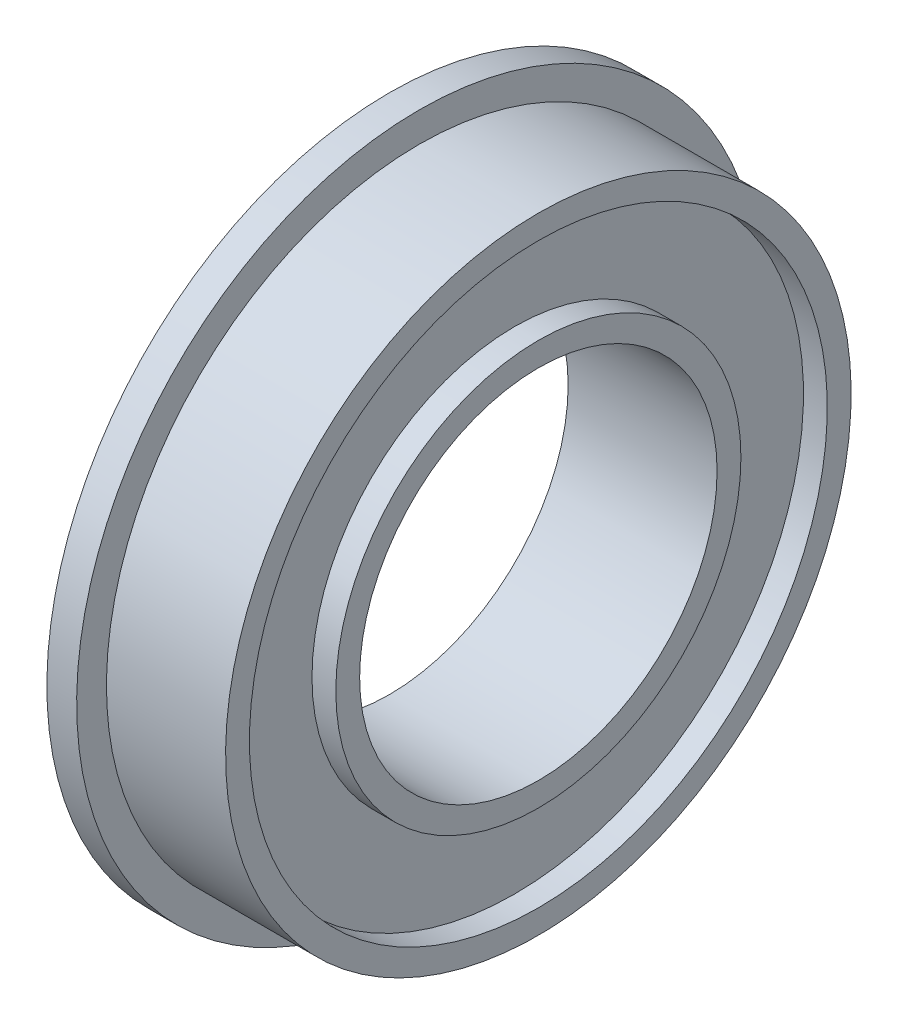
ISO-10303-21;
HEADER;
FILE_DESCRIPTION(('STEP AP214'),'2;1');
FILE_NAME('part.step','',(''),(''),'','','');
FILE_SCHEMA(('AUTOMOTIVE_DESIGN { 1 0 10303 214 1 1 1 1 }'));
ENDSEC;
DATA;
#1=APPLICATION_CONTEXT('core data for automotive mechanical design processes');
#2=APPLICATION_PROTOCOL_DEFINITION('international standard','automotive_design',2000,#1);
#3=PRODUCT_CONTEXT('',#1,'mechanical');
#4=PRODUCT('Part','Part','',(#3));
#5=PRODUCT_RELATED_PRODUCT_CATEGORY('part','',(#4));
#6=PRODUCT_DEFINITION_FORMATION('','',#4);
#7=PRODUCT_DEFINITION_CONTEXT('part definition',#1,'design');
#8=PRODUCT_DEFINITION('design','',#6,#7);
#9=PRODUCT_DEFINITION_SHAPE('','',#8);
#10=(LENGTH_UNIT() NAMED_UNIT(*) SI_UNIT(.MILLI.,.METRE.));
#11=(NAMED_UNIT(*) PLANE_ANGLE_UNIT() SI_UNIT($,.RADIAN.));
#12=(NAMED_UNIT(*) SI_UNIT($,.STERADIAN.) SOLID_ANGLE_UNIT());
#13=UNCERTAINTY_MEASURE_WITH_UNIT(LENGTH_MEASURE(1.E-05),#10,'distance_accuracy_value','');
#14=(GEOMETRIC_REPRESENTATION_CONTEXT(3) GLOBAL_UNCERTAINTY_ASSIGNED_CONTEXT((#13)) GLOBAL_UNIT_ASSIGNED_CONTEXT((#10,
#11,#12)) REPRESENTATION_CONTEXT('',''));
#15=CARTESIAN_POINT('',(0.,0.,0.));
#16=DIRECTION('',(0.,0.,1.));
#17=DIRECTION('',(1.,0.,0.));
#18=AXIS2_PLACEMENT_3D('',#15,#16,#17);
#19=CARTESIAN_POINT('',(0.,6.56829268292682,0.));
#20=DIRECTION('',(-1.,0.,0.));
#21=DIRECTION('',(0.,-1.,0.));
#22=AXIS2_PLACEMENT_3D('',#19,#20,#21);
#23=PLANE('',#22);
#24=CARTESIAN_POINT('',(0.,-3.13170731707318,0.));
#25=DIRECTION('',(1.,0.,0.));
#26=DIRECTION('',(0.,1.,0.));
#27=AXIS2_PLACEMENT_3D('',#24,#25,#26);
#28=CIRCLE('',#27,9.7);
#29=CARTESIAN_POINT('',(0.,6.56829268292682,0.));
#30=VERTEX_POINT('',#29);
#31=EDGE_CURVE('E80',#30,#30,#28,.T.);
#32=ORIENTED_EDGE('',*,*,#31,.T.);
#33=EDGE_LOOP('',(#32));
#34=FACE_BOUND('',#33,.T.);
#35=CARTESIAN_POINT('',(0.,-3.13170731707318,0.));
#36=DIRECTION('',(1.,0.,0.));
#37=DIRECTION('',(0.,1.,0.));
#38=AXIS2_PLACEMENT_3D('',#35,#36,#37);
#39=CIRCLE('',#38,11.5);
#40=CARTESIAN_POINT('',(0.,8.36829268292682,0.));
#41=VERTEX_POINT('',#40);
#42=EDGE_CURVE('E10',#41,#41,#39,.T.);
#43=ORIENTED_EDGE('',*,*,#42,.F.);
#44=EDGE_LOOP('',(#43));
#45=FACE_BOUND('',#44,.T.);
#46=ADVANCED_FACE('F34',(#34,#45),#23,.T.);
#47=CARTESIAN_POINT('',(0.,-3.13170731707318,0.));
#48=DIRECTION('',(1.,0.,0.));
#49=DIRECTION('',(0.,1.,0.));
#50=AXIS2_PLACEMENT_3D('',#47,#48,#49);
#51=CYLINDRICAL_SURFACE('',#50,11.5);
#52=ORIENTED_EDGE('',*,*,#42,.T.);
#53=EDGE_LOOP('',(#52));
#54=FACE_BOUND('',#53,.T.);
#55=CARTESIAN_POINT('',(1.,-3.13170731707318,0.));
#56=DIRECTION('',(1.,0.,0.));
#57=DIRECTION('',(0.,1.,0.));
#58=AXIS2_PLACEMENT_3D('',#55,#56,#57);
#59=CIRCLE('',#58,11.5);
#60=CARTESIAN_POINT('',(1.,8.36829268292682,0.));
#61=VERTEX_POINT('',#60);
#62=EDGE_CURVE('E40',#61,#61,#59,.T.);
#63=ORIENTED_EDGE('',*,*,#62,.F.);
#64=EDGE_LOOP('',(#63));
#65=FACE_BOUND('',#64,.T.);
#66=ADVANCED_FACE('F98',(#54,#65),#51,.T.);
#67=CARTESIAN_POINT('',(1.,8.36829268292682,0.));
#68=DIRECTION('',(1.,0.,0.));
#69=DIRECTION('',(0.,1.,0.));
#70=AXIS2_PLACEMENT_3D('',#67,#68,#69);
#71=PLANE('',#70);
#72=ORIENTED_EDGE('',*,*,#62,.T.);
#73=EDGE_LOOP('',(#72));
#74=FACE_BOUND('',#73,.T.);
#75=CARTESIAN_POINT('',(1.,-3.13170731707318,0.));
#76=DIRECTION('',(1.,0.,0.));
#77=DIRECTION('',(0.,1.,0.));
#78=AXIS2_PLACEMENT_3D('',#75,#76,#77);
#79=CIRCLE('',#78,10.5);
#80=CARTESIAN_POINT('',(1.,7.36829268292682,0.));
#81=VERTEX_POINT('',#80);
#82=EDGE_CURVE('E44',#81,#81,#79,.T.);
#83=ORIENTED_EDGE('',*,*,#82,.F.);
#84=EDGE_LOOP('',(#83));
#85=FACE_BOUND('',#84,.T.);
#86=ADVANCED_FACE('F102',(#74,#85),#71,.T.);
#87=CARTESIAN_POINT('',(0.,-3.13170731707318,0.));
#88=DIRECTION('',(1.,0.,0.));
#89=DIRECTION('',(0.,1.,0.));
#90=AXIS2_PLACEMENT_3D('',#87,#88,#89);
#91=CYLINDRICAL_SURFACE('',#90,10.5);
#92=ORIENTED_EDGE('',*,*,#82,.T.);
#93=EDGE_LOOP('',(#92));
#94=FACE_BOUND('',#93,.T.);
#95=CARTESIAN_POINT('',(5.,-3.13170731707318,0.));
#96=DIRECTION('',(1.,0.,0.));
#97=DIRECTION('',(0.,1.,0.));
#98=AXIS2_PLACEMENT_3D('',#95,#96,#97);
#99=CIRCLE('',#98,10.5);
#100=CARTESIAN_POINT('',(5.,7.36829268292682,0.));
#101=VERTEX_POINT('',#100);
#102=EDGE_CURVE('E48',#101,#101,#99,.T.);
#103=ORIENTED_EDGE('',*,*,#102,.F.);
#104=EDGE_LOOP('',(#103));
#105=FACE_BOUND('',#104,.T.);
#106=ADVANCED_FACE('F106',(#94,#105),#91,.T.);
#107=CARTESIAN_POINT('',(5.,7.36829268292682,0.));
#108=DIRECTION('',(1.,0.,0.));
#109=DIRECTION('',(0.,1.,0.));
#110=AXIS2_PLACEMENT_3D('',#107,#108,#109);
#111=PLANE('',#110);
#112=ORIENTED_EDGE('',*,*,#102,.T.);
#113=EDGE_LOOP('',(#112));
#114=FACE_BOUND('',#113,.T.);
#115=CARTESIAN_POINT('',(5.,-3.13170731707318,0.));
#116=DIRECTION('',(1.,0.,0.));
#117=DIRECTION('',(0.,1.,0.));
#118=AXIS2_PLACEMENT_3D('',#115,#116,#117);
#119=CIRCLE('',#118,9.7);
#120=CARTESIAN_POINT('',(5.,6.56829268292682,0.));
#121=VERTEX_POINT('',#120);
#122=EDGE_CURVE('E53',#121,#121,#119,.T.);
#123=ORIENTED_EDGE('',*,*,#122,.F.);
#124=EDGE_LOOP('',(#123));
#125=FACE_BOUND('',#124,.T.);
#126=ADVANCED_FACE('F112',(#114,#125),#111,.T.);
#127=CARTESIAN_POINT('',(0.,-3.13170731707318,0.));
#128=DIRECTION('',(1.,0.,0.));
#129=DIRECTION('',(0.,1.,0.));
#130=AXIS2_PLACEMENT_3D('',#127,#128,#129);
#131=CYLINDRICAL_SURFACE('',#130,9.7);
#132=ORIENTED_EDGE('',*,*,#122,.T.);
#133=EDGE_LOOP('',(#132));
#134=FACE_BOUND('',#133,.T.);
#135=CARTESIAN_POINT('',(4.2,-3.13170731707318,0.));
#136=DIRECTION('',(1.,0.,0.));
#137=DIRECTION('',(0.,1.,0.));
#138=AXIS2_PLACEMENT_3D('',#135,#136,#137);
#139=CIRCLE('',#138,9.7);
#140=CARTESIAN_POINT('',(4.2,6.56829268292682,0.));
#141=VERTEX_POINT('',#140);
#142=EDGE_CURVE('E56',#141,#141,#139,.T.);
#143=ORIENTED_EDGE('',*,*,#142,.F.);
#144=EDGE_LOOP('',(#143));
#145=FACE_BOUND('',#144,.T.);
#146=ADVANCED_FACE('F116',(#134,#145),#131,.F.);
#147=CARTESIAN_POINT('',(4.2,6.56829268292682,0.));
#148=DIRECTION('',(1.,0.,0.));
#149=DIRECTION('',(0.,1.,0.));
#150=AXIS2_PLACEMENT_3D('',#147,#148,#149);
#151=PLANE('',#150);
#152=ORIENTED_EDGE('',*,*,#142,.T.);
#153=EDGE_LOOP('',(#152));
#154=FACE_BOUND('',#153,.T.);
#155=CARTESIAN_POINT('',(4.2,-3.13170731707318,0.));
#156=DIRECTION('',(1.,0.,0.));
#157=DIRECTION('',(0.,1.,0.));
#158=AXIS2_PLACEMENT_3D('',#155,#156,#157);
#159=CIRCLE('',#158,6.8);
#160=CARTESIAN_POINT('',(4.2,3.66829268292682,0.));
#161=VERTEX_POINT('',#160);
#162=EDGE_CURVE('E59',#161,#161,#159,.T.);
#163=ORIENTED_EDGE('',*,*,#162,.F.);
#164=EDGE_LOOP('',(#163));
#165=FACE_BOUND('',#164,.T.);
#166=ADVANCED_FACE('F120',(#154,#165),#151,.T.);
#167=CARTESIAN_POINT('',(0.,-3.13170731707318,0.));
#168=DIRECTION('',(1.,0.,0.));
#169=DIRECTION('',(0.,1.,0.));
#170=AXIS2_PLACEMENT_3D('',#167,#168,#169);
#171=CYLINDRICAL_SURFACE('',#170,6.8);
#172=ORIENTED_EDGE('',*,*,#162,.T.);
#173=EDGE_LOOP('',(#172));
#174=FACE_BOUND('',#173,.T.);
#175=CARTESIAN_POINT('',(5.,-3.13170731707318,0.));
#176=DIRECTION('',(1.,0.,0.));
#177=DIRECTION('',(0.,1.,0.));
#178=AXIS2_PLACEMENT_3D('',#175,#176,#177);
#179=CIRCLE('',#178,6.8);
#180=CARTESIAN_POINT('',(5.,3.66829268292682,0.));
#181=VERTEX_POINT('',#180);
#182=EDGE_CURVE('E62',#181,#181,#179,.T.);
#183=ORIENTED_EDGE('',*,*,#182,.F.);
#184=EDGE_LOOP('',(#183));
#185=FACE_BOUND('',#184,.T.);
#186=ADVANCED_FACE('F124',(#174,#185),#171,.T.);
#187=CARTESIAN_POINT('',(5.,3.66829268292682,0.));
#188=DIRECTION('',(1.,0.,0.));
#189=DIRECTION('',(0.,1.,0.));
#190=AXIS2_PLACEMENT_3D('',#187,#188,#189);
#191=PLANE('',#190);
#192=ORIENTED_EDGE('',*,*,#182,.T.);
#193=EDGE_LOOP('',(#192));
#194=FACE_BOUND('',#193,.T.);
#195=CARTESIAN_POINT('',(5.,-3.13170731707318,0.));
#196=DIRECTION('',(1.,0.,0.));
#197=DIRECTION('',(0.,1.,0.));
#198=AXIS2_PLACEMENT_3D('',#195,#196,#197);
#199=CIRCLE('',#198,6.);
#200=CARTESIAN_POINT('',(5.,2.86829268292682,0.));
#201=VERTEX_POINT('',#200);
#202=EDGE_CURVE('E65',#201,#201,#199,.T.);
#203=ORIENTED_EDGE('',*,*,#202,.F.);
#204=EDGE_LOOP('',(#203));
#205=FACE_BOUND('',#204,.T.);
#206=ADVANCED_FACE('F128',(#194,#205),#191,.T.);
#207=CARTESIAN_POINT('',(0.,-3.13170731707318,0.));
#208=DIRECTION('',(1.,0.,0.));
#209=DIRECTION('',(0.,1.,0.));
#210=AXIS2_PLACEMENT_3D('',#207,#208,#209);
#211=CYLINDRICAL_SURFACE('',#210,6.);
#212=ORIENTED_EDGE('',*,*,#202,.T.);
#213=EDGE_LOOP('',(#212));
#214=FACE_BOUND('',#213,.T.);
#215=CARTESIAN_POINT('',(0.,-3.13170731707318,0.));
#216=DIRECTION('',(1.,0.,0.));
#217=DIRECTION('',(0.,1.,0.));
#218=AXIS2_PLACEMENT_3D('',#215,#216,#217);
#219=CIRCLE('',#218,6.);
#220=CARTESIAN_POINT('',(0.,2.86829268292682,0.));
#221=VERTEX_POINT('',#220);
#222=EDGE_CURVE('E68',#221,#221,#219,.T.);
#223=ORIENTED_EDGE('',*,*,#222,.F.);
#224=EDGE_LOOP('',(#223));
#225=FACE_BOUND('',#224,.T.);
#226=ADVANCED_FACE('F132',(#214,#225),#211,.F.);
#227=CARTESIAN_POINT('',(0.,2.86829268292682,0.));
#228=DIRECTION('',(-1.,0.,0.));
#229=DIRECTION('',(0.,-1.,0.));
#230=AXIS2_PLACEMENT_3D('',#227,#228,#229);
#231=PLANE('',#230);
#232=ORIENTED_EDGE('',*,*,#222,.T.);
#233=EDGE_LOOP('',(#232));
#234=FACE_BOUND('',#233,.T.);
#235=CARTESIAN_POINT('',(0.,-3.13170731707318,0.));
#236=DIRECTION('',(1.,0.,0.));
#237=DIRECTION('',(0.,1.,0.));
#238=AXIS2_PLACEMENT_3D('',#235,#236,#237);
#239=CIRCLE('',#238,6.8);
#240=CARTESIAN_POINT('',(0.,3.66829268292682,0.));
#241=VERTEX_POINT('',#240);
#242=EDGE_CURVE('E71',#241,#241,#239,.T.);
#243=ORIENTED_EDGE('',*,*,#242,.F.);
#244=EDGE_LOOP('',(#243));
#245=FACE_BOUND('',#244,.T.);
#246=ADVANCED_FACE('F136',(#234,#245),#231,.T.);
#247=CARTESIAN_POINT('',(0.,-3.13170731707318,0.));
#248=DIRECTION('',(1.,0.,0.));
#249=DIRECTION('',(0.,1.,0.));
#250=AXIS2_PLACEMENT_3D('',#247,#248,#249);
#251=CYLINDRICAL_SURFACE('',#250,6.8);
#252=ORIENTED_EDGE('',*,*,#242,.T.);
#253=EDGE_LOOP('',(#252));
#254=FACE_BOUND('',#253,.T.);
#255=CARTESIAN_POINT('',(0.800000000000001,-3.13170731707318,0.));
#256=DIRECTION('',(1.,0.,0.));
#257=DIRECTION('',(0.,1.,0.));
#258=AXIS2_PLACEMENT_3D('',#255,#256,#257);
#259=CIRCLE('',#258,6.8);
#260=CARTESIAN_POINT('',(0.8,3.66829268292682,0.));
#261=VERTEX_POINT('',#260);
#262=EDGE_CURVE('E74',#261,#261,#259,.T.);
#263=ORIENTED_EDGE('',*,*,#262,.F.);
#264=EDGE_LOOP('',(#263));
#265=FACE_BOUND('',#264,.T.);
#266=ADVANCED_FACE('F94',(#254,#265),#251,.T.);
#267=CARTESIAN_POINT('',(0.8,3.66829268292682,0.));
#268=DIRECTION('',(-1.,0.,0.));
#269=DIRECTION('',(0.,-1.,0.));
#270=AXIS2_PLACEMENT_3D('',#267,#268,#269);
#271=PLANE('',#270);
#272=ORIENTED_EDGE('',*,*,#262,.T.);
#273=EDGE_LOOP('',(#272));
#274=FACE_BOUND('',#273,.T.);
#275=CARTESIAN_POINT('',(0.800000000000001,-3.13170731707318,0.));
#276=DIRECTION('',(1.,0.,0.));
#277=DIRECTION('',(0.,1.,0.));
#278=AXIS2_PLACEMENT_3D('',#275,#276,#277);
#279=CIRCLE('',#278,9.7);
#280=CARTESIAN_POINT('',(0.8,6.56829268292682,0.));
#281=VERTEX_POINT('',#280);
#282=EDGE_CURVE('E77',#281,#281,#279,.T.);
#283=ORIENTED_EDGE('',*,*,#282,.F.);
#284=EDGE_LOOP('',(#283));
#285=FACE_BOUND('',#284,.T.);
#286=ADVANCED_FACE('F88',(#274,#285),#271,.T.);
#287=CARTESIAN_POINT('',(0.,-3.13170731707318,0.));
#288=DIRECTION('',(1.,0.,0.));
#289=DIRECTION('',(0.,1.,0.));
#290=AXIS2_PLACEMENT_3D('',#287,#288,#289);
#291=CYLINDRICAL_SURFACE('',#290,9.7);
#292=ORIENTED_EDGE('',*,*,#282,.T.);
#293=EDGE_LOOP('',(#292));
#294=FACE_BOUND('',#293,.T.);
#295=ORIENTED_EDGE('',*,*,#31,.F.);
#296=EDGE_LOOP('',(#295));
#297=FACE_BOUND('',#296,.T.);
#298=ADVANCED_FACE('F86',(#294,#297),#291,.F.);
#299=CLOSED_SHELL('',(#46,#66,#86,#106,#126,#146,#166,#186,#206,#226,#246,#266,#286,#298));
#300=MANIFOLD_SOLID_BREP('B2',#299);
#301=ADVANCED_BREP_SHAPE_REPRESENTATION('',(#18,#300),#14);
#302=SHAPE_DEFINITION_REPRESENTATION(#9,#301);
ENDSEC;
END-ISO-10303-21;
